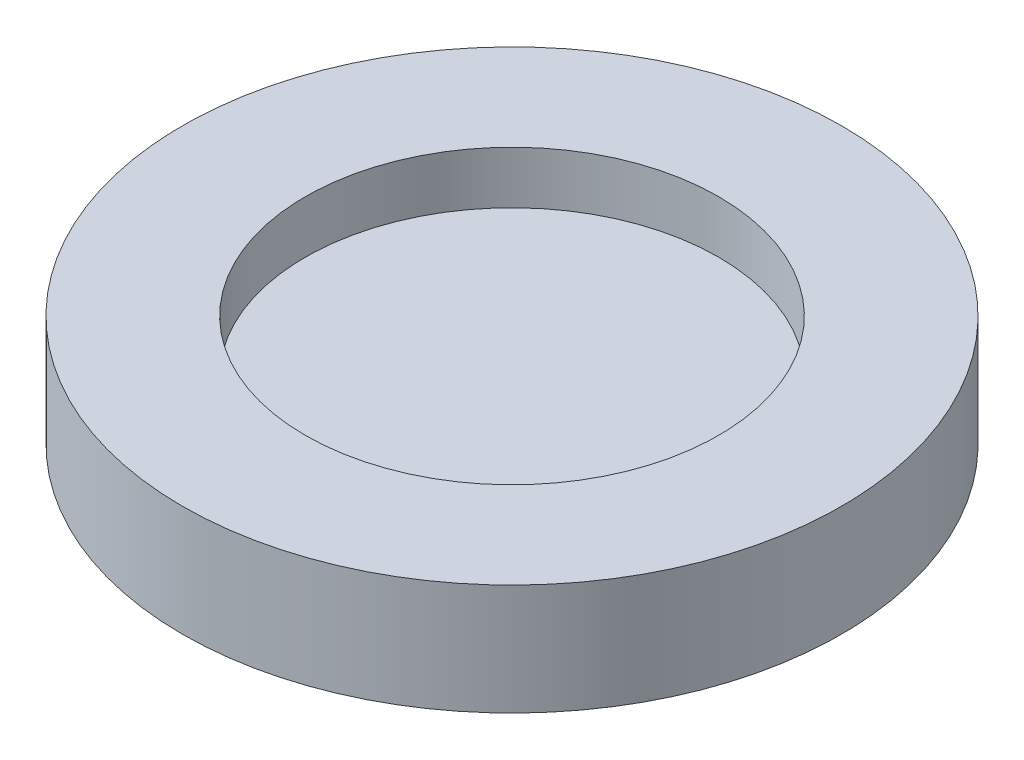
ISO-10303-21;
HEADER;
FILE_DESCRIPTION(('STEP AP214'),'2;1');
FILE_NAME('part.step','',(''),(''),'','','');
FILE_SCHEMA(('AUTOMOTIVE_DESIGN { 1 0 10303 214 1 1 1 1 }'));
ENDSEC;
DATA;
#1=APPLICATION_CONTEXT('core data for automotive mechanical design processes');
#2=APPLICATION_PROTOCOL_DEFINITION('international standard','automotive_design',2000,#1);
#3=PRODUCT_CONTEXT('',#1,'mechanical');
#4=PRODUCT('Part','Part','',(#3));
#5=PRODUCT_RELATED_PRODUCT_CATEGORY('part','',(#4));
#6=PRODUCT_DEFINITION_FORMATION('','',#4);
#7=PRODUCT_DEFINITION_CONTEXT('part definition',#1,'design');
#8=PRODUCT_DEFINITION('design','',#6,#7);
#9=PRODUCT_DEFINITION_SHAPE('','',#8);
#10=(LENGTH_UNIT() NAMED_UNIT(*) SI_UNIT(.MILLI.,.METRE.));
#11=(NAMED_UNIT(*) PLANE_ANGLE_UNIT() SI_UNIT($,.RADIAN.));
#12=(NAMED_UNIT(*) SI_UNIT($,.STERADIAN.) SOLID_ANGLE_UNIT());
#13=UNCERTAINTY_MEASURE_WITH_UNIT(LENGTH_MEASURE(1.E-05),#10,'distance_accuracy_value','');
#14=(GEOMETRIC_REPRESENTATION_CONTEXT(3) GLOBAL_UNCERTAINTY_ASSIGNED_CONTEXT((#13)) GLOBAL_UNIT_ASSIGNED_CONTEXT((#10,
#11,#12)) REPRESENTATION_CONTEXT('',''));
#15=CARTESIAN_POINT('',(0.,0.,0.));
#16=DIRECTION('',(0.,0.,1.));
#17=DIRECTION('',(1.,0.,0.));
#18=AXIS2_PLACEMENT_3D('',#15,#16,#17);
#19=CARTESIAN_POINT('',(0.,0.,0.));
#20=DIRECTION('',(0.,1.,0.));
#21=DIRECTION('',(0.,0.,1.));
#22=AXIS2_PLACEMENT_3D('',#19,#20,#21);
#23=CYLINDRICAL_SURFACE('',#22,6.9);
#24=CARTESIAN_POINT('',(0.,0.,0.));
#25=DIRECTION('',(0.,1.,0.));
#26=DIRECTION('',(0.,0.,1.));
#27=AXIS2_PLACEMENT_3D('',#24,#25,#26);
#28=CIRCLE('',#27,6.9);
#29=CARTESIAN_POINT('',(0.,0.,6.9));
#30=VERTEX_POINT('',#29);
#31=EDGE_CURVE('E50',#30,#30,#28,.T.);
#32=ORIENTED_EDGE('',*,*,#31,.F.);
#33=EDGE_LOOP('',(#32));
#34=FACE_BOUND('',#33,.T.);
#35=CARTESIAN_POINT('',(0.,1.75,0.));
#36=DIRECTION('',(0.,1.,0.));
#37=DIRECTION('',(0.,0.,1.));
#38=AXIS2_PLACEMENT_3D('',#35,#36,#37);
#39=CIRCLE('',#38,6.9);
#40=CARTESIAN_POINT('',(0.,1.75,6.9));
#41=VERTEX_POINT('',#40);
#42=EDGE_CURVE('E10',#41,#41,#39,.F.);
#43=ORIENTED_EDGE('',*,*,#42,.F.);
#44=EDGE_LOOP('',(#43));
#45=FACE_BOUND('',#44,.T.);
#46=ADVANCED_FACE('F34',(#34,#45),#23,.F.);
#47=CARTESIAN_POINT('',(0.,3.7,0.));
#48=DIRECTION('',(0.,-1.,0.));
#49=DIRECTION('',(0.,0.,-1.));
#50=AXIS2_PLACEMENT_3D('',#47,#48,#49);
#51=CYLINDRICAL_SURFACE('',#50,11.);
#52=CARTESIAN_POINT('',(0.,3.7,0.));
#53=DIRECTION('',(0.,1.,0.));
#54=DIRECTION('',(0.,0.,1.));
#55=AXIS2_PLACEMENT_3D('',#52,#53,#54);
#56=CIRCLE('',#55,11.);
#57=CARTESIAN_POINT('',(0.,3.7,11.));
#58=VERTEX_POINT('',#57);
#59=EDGE_CURVE('E41',#58,#58,#56,.T.);
#60=ORIENTED_EDGE('',*,*,#59,.F.);
#61=EDGE_LOOP('',(#60));
#62=FACE_BOUND('',#61,.T.);
#63=CARTESIAN_POINT('',(0.,0.,0.));
#64=DIRECTION('',(0.,1.,0.));
#65=DIRECTION('',(0.,0.,1.));
#66=AXIS2_PLACEMENT_3D('',#63,#64,#65);
#67=CIRCLE('',#66,11.);
#68=CARTESIAN_POINT('',(0.,0.,11.));
#69=VERTEX_POINT('',#68);
#70=EDGE_CURVE('E45',#69,#69,#67,.T.);
#71=ORIENTED_EDGE('',*,*,#70,.T.);
#72=EDGE_LOOP('',(#71));
#73=FACE_BOUND('',#72,.T.);
#74=ADVANCED_FACE('F36',(#62,#73),#51,.T.);
#75=CARTESIAN_POINT('',(0.,3.7,0.));
#76=DIRECTION('',(0.,1.,0.));
#77=DIRECTION('',(0.,0.,1.));
#78=AXIS2_PLACEMENT_3D('',#75,#76,#77);
#79=PLANE('',#78);
#80=CARTESIAN_POINT('',(0.,3.7,0.));
#81=DIRECTION('',(0.,1.,0.));
#82=DIRECTION('',(0.,0.,1.));
#83=AXIS2_PLACEMENT_3D('',#80,#81,#82);
#84=CIRCLE('',#83,6.9);
#85=CARTESIAN_POINT('',(0.,3.7,6.9));
#86=VERTEX_POINT('',#85);
#87=EDGE_CURVE('E53',#86,#86,#84,.T.);
#88=ORIENTED_EDGE('',*,*,#87,.F.);
#89=EDGE_LOOP('',(#88));
#90=FACE_BOUND('',#89,.T.);
#91=ORIENTED_EDGE('',*,*,#59,.T.);
#92=EDGE_LOOP('',(#91));
#93=FACE_BOUND('',#92,.T.);
#94=ADVANCED_FACE('F75',(#90,#93),#79,.T.);
#95=CARTESIAN_POINT('',(0.,0.,0.));
#96=DIRECTION('',(0.,1.,0.));
#97=DIRECTION('',(0.,0.,1.));
#98=AXIS2_PLACEMENT_3D('',#95,#96,#97);
#99=PLANE('',#98);
#100=ORIENTED_EDGE('',*,*,#31,.T.);
#101=EDGE_LOOP('',(#100));
#102=FACE_BOUND('',#101,.T.);
#103=ORIENTED_EDGE('',*,*,#70,.F.);
#104=EDGE_LOOP('',(#103));
#105=FACE_BOUND('',#104,.T.);
#106=ADVANCED_FACE('F65',(#102,#105),#99,.F.);
#107=CARTESIAN_POINT('',(0.,1.95,0.));
#108=DIRECTION('',(0.,1.,0.));
#109=DIRECTION('',(0.,0.,1.));
#110=AXIS2_PLACEMENT_3D('',#107,#108,#109);
#111=CIRCLE('',#110,6.9);
#112=CARTESIAN_POINT('',(0.,1.95,6.9));
#113=VERTEX_POINT('',#112);
#114=EDGE_CURVE('E55',#113,#113,#111,.F.);
#115=ORIENTED_EDGE('',*,*,#114,.T.);
#116=EDGE_LOOP('',(#115));
#117=FACE_BOUND('',#116,.T.);
#118=ORIENTED_EDGE('',*,*,#87,.T.);
#119=EDGE_LOOP('',(#118));
#120=FACE_BOUND('',#119,.T.);
#121=ADVANCED_FACE('F71',(#117,#120),#23,.F.);
#122=CARTESIAN_POINT('',(0.,1.95,0.));
#123=DIRECTION('',(0.,1.,0.));
#124=DIRECTION('',(0.,0.,1.));
#125=AXIS2_PLACEMENT_3D('',#122,#123,#124);
#126=PLANE('',#125);
#127=ORIENTED_EDGE('',*,*,#114,.F.);
#128=EDGE_LOOP('',(#127));
#129=FACE_BOUND('',#128,.T.);
#130=ADVANCED_FACE('F80',(#129),#126,.T.);
#131=CARTESIAN_POINT('',(0.,1.75,0.));
#132=DIRECTION('',(0.,1.,0.));
#133=DIRECTION('',(0.,0.,1.));
#134=AXIS2_PLACEMENT_3D('',#131,#132,#133);
#135=PLANE('',#134);
#136=ORIENTED_EDGE('',*,*,#42,.T.);
#137=EDGE_LOOP('',(#136));
#138=FACE_BOUND('',#137,.T.);
#139=ADVANCED_FACE('F85',(#138),#135,.F.);
#140=CLOSED_SHELL('',(#46,#74,#94,#106,#121,#130,#139));
#141=MANIFOLD_SOLID_BREP('B2',#140);
#142=ADVANCED_BREP_SHAPE_REPRESENTATION('',(#18,#141),#14);
#143=SHAPE_DEFINITION_REPRESENTATION(#9,#142);
ENDSEC;
END-ISO-10303-21;
